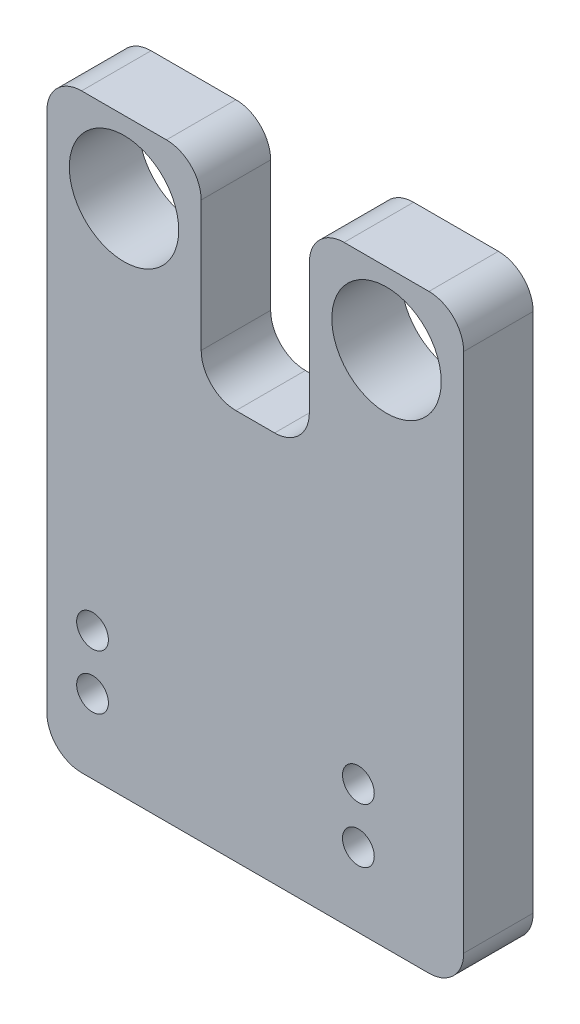
ISO-10303-21;
HEADER;
FILE_DESCRIPTION(('STEP AP214'),'2;1');
FILE_NAME('part.step','',(''),(''),'','','');
FILE_SCHEMA(('AUTOMOTIVE_DESIGN { 1 0 10303 214 1 1 1 1 }'));
ENDSEC;
DATA;
#1=APPLICATION_CONTEXT('core data for automotive mechanical design processes');
#2=APPLICATION_PROTOCOL_DEFINITION('international standard','automotive_design',2000,#1);
#3=PRODUCT_CONTEXT('',#1,'mechanical');
#4=PRODUCT('Part','Part','',(#3));
#5=PRODUCT_RELATED_PRODUCT_CATEGORY('part','',(#4));
#6=PRODUCT_DEFINITION_FORMATION('','',#4);
#7=PRODUCT_DEFINITION_CONTEXT('part definition',#1,'design');
#8=PRODUCT_DEFINITION('design','',#6,#7);
#9=PRODUCT_DEFINITION_SHAPE('','',#8);
#10=(LENGTH_UNIT() NAMED_UNIT(*) SI_UNIT(.MILLI.,.METRE.));
#11=(NAMED_UNIT(*) PLANE_ANGLE_UNIT() SI_UNIT($,.RADIAN.));
#12=(NAMED_UNIT(*) SI_UNIT($,.STERADIAN.) SOLID_ANGLE_UNIT());
#13=UNCERTAINTY_MEASURE_WITH_UNIT(LENGTH_MEASURE(1.E-05),#10,'distance_accuracy_value','');
#14=(GEOMETRIC_REPRESENTATION_CONTEXT(3) GLOBAL_UNCERTAINTY_ASSIGNED_CONTEXT((#13)) GLOBAL_UNIT_ASSIGNED_CONTEXT((#10,
#11,#12)) REPRESENTATION_CONTEXT('',''));
#15=CARTESIAN_POINT('',(0.,0.,0.));
#16=DIRECTION('',(0.,0.,1.));
#17=DIRECTION('',(1.,0.,0.));
#18=AXIS2_PLACEMENT_3D('',#15,#16,#17);
#19=CARTESIAN_POINT('',(-38.1,0.,6.35));
#20=DIRECTION('',(1.,0.,0.));
#21=DIRECTION('',(0.,0.,-1.));
#22=AXIS2_PLACEMENT_3D('',#19,#20,#21);
#23=PLANE('',#22);
#24=DIRECTION('',(0.,-1.,0.));
#25=VECTOR('',#24,1.);
#26=CARTESIAN_POINT('',(-38.1,0.,-6.35));
#27=LINE('',#26,#25);
#28=CARTESIAN_POINT('',(-38.1,23.625,-6.35));
#29=VERTEX_POINT('',#28);
#30=CARTESIAN_POINT('',(-38.1,-71.625,-6.35));
#31=VERTEX_POINT('',#30);
#32=EDGE_CURVE('E295',#29,#31,#27,.T.);
#33=ORIENTED_EDGE('',*,*,#32,.T.);
#34=DIRECTION('',(0.,0.,-1.));
#35=VECTOR('',#34,1.);
#36=CARTESIAN_POINT('',(-38.1,-71.625,6.35));
#37=LINE('',#36,#35);
#38=CARTESIAN_POINT('',(-38.1,-71.625,6.35));
#39=VERTEX_POINT('',#38);
#40=EDGE_CURVE('E224',#31,#39,#37,.F.);
#41=ORIENTED_EDGE('',*,*,#40,.T.);
#42=DIRECTION('',(0.,-1.,0.));
#43=VECTOR('',#42,1.);
#44=CARTESIAN_POINT('',(-38.1,0.,6.35));
#45=LINE('',#44,#43);
#46=CARTESIAN_POINT('',(-38.1,23.625,6.35));
#47=VERTEX_POINT('',#46);
#48=EDGE_CURVE('E330',#47,#39,#45,.T.);
#49=ORIENTED_EDGE('',*,*,#48,.F.);
#50=DIRECTION('',(0.,0.,-1.));
#51=VECTOR('',#50,1.);
#52=CARTESIAN_POINT('',(-38.1,23.625,-6.35));
#53=LINE('',#52,#51);
#54=EDGE_CURVE('E221',#47,#29,#53,.T.);
#55=ORIENTED_EDGE('',*,*,#54,.T.);
#56=EDGE_LOOP('',(#33,#41,#49,#55));
#57=FACE_BOUND('',#56,.T.);
#58=ADVANCED_FACE('F43',(#57),#23,.F.);
#59=CARTESIAN_POINT('',(0.,-77.975,6.35));
#60=DIRECTION('',(0.,1.,0.));
#61=DIRECTION('',(0.,0.,1.));
#62=AXIS2_PLACEMENT_3D('',#59,#60,#61);
#63=PLANE('',#62);
#64=DIRECTION('',(1.,0.,0.));
#65=VECTOR('',#64,1.);
#66=CARTESIAN_POINT('',(0.,-77.975,-6.35));
#67=LINE('',#66,#65);
#68=CARTESIAN_POINT('',(-31.75,-77.975,-6.35));
#69=VERTEX_POINT('',#68);
#70=CARTESIAN_POINT('',(31.75,-77.975,-6.35));
#71=VERTEX_POINT('',#70);
#72=EDGE_CURVE('E298',#69,#71,#67,.T.);
#73=ORIENTED_EDGE('',*,*,#72,.T.);
#74=DIRECTION('',(0.,0.,-1.));
#75=VECTOR('',#74,1.);
#76=CARTESIAN_POINT('',(31.75,-77.975,6.35));
#77=LINE('',#76,#75);
#78=CARTESIAN_POINT('',(31.75,-77.975,6.35));
#79=VERTEX_POINT('',#78);
#80=EDGE_CURVE('E219',#71,#79,#77,.F.);
#81=ORIENTED_EDGE('',*,*,#80,.T.);
#82=DIRECTION('',(1.,0.,0.));
#83=VECTOR('',#82,1.);
#84=CARTESIAN_POINT('',(0.,-77.975,6.35));
#85=LINE('',#84,#83);
#86=CARTESIAN_POINT('',(-31.75,-77.975,6.35));
#87=VERTEX_POINT('',#86);
#88=EDGE_CURVE('E333',#87,#79,#85,.T.);
#89=ORIENTED_EDGE('',*,*,#88,.F.);
#90=DIRECTION('',(0.,0.,-1.));
#91=VECTOR('',#90,1.);
#92=CARTESIAN_POINT('',(-31.75,-77.975,6.35));
#93=LINE('',#92,#91);
#94=EDGE_CURVE('E216',#87,#69,#93,.T.);
#95=ORIENTED_EDGE('',*,*,#94,.T.);
#96=EDGE_LOOP('',(#73,#81,#89,#95));
#97=FACE_BOUND('',#96,.T.);
#98=ADVANCED_FACE('F352',(#97),#63,.F.);
#99=CARTESIAN_POINT('',(38.1,0.,6.35));
#100=DIRECTION('',(1.,0.,0.));
#101=DIRECTION('',(0.,0.,-1.));
#102=AXIS2_PLACEMENT_3D('',#99,#100,#101);
#103=PLANE('',#102);
#104=DIRECTION('',(0.,-1.,0.));
#105=VECTOR('',#104,1.);
#106=CARTESIAN_POINT('',(38.1,0.,-6.35));
#107=LINE('',#106,#105);
#108=CARTESIAN_POINT('',(38.1,23.625,-6.35));
#109=VERTEX_POINT('',#108);
#110=CARTESIAN_POINT('',(38.1,-71.625,-6.35));
#111=VERTEX_POINT('',#110);
#112=EDGE_CURVE('E178',#109,#111,#107,.T.);
#113=ORIENTED_EDGE('',*,*,#112,.F.);
#114=DIRECTION('',(0.,0.,-1.));
#115=VECTOR('',#114,1.);
#116=CARTESIAN_POINT('',(38.1,23.625,6.35));
#117=LINE('',#116,#115);
#118=CARTESIAN_POINT('',(38.1,23.625,6.35));
#119=VERTEX_POINT('',#118);
#120=EDGE_CURVE('E204',#109,#119,#117,.F.);
#121=ORIENTED_EDGE('',*,*,#120,.T.);
#122=DIRECTION('',(0.,-1.,0.));
#123=VECTOR('',#122,1.);
#124=CARTESIAN_POINT('',(38.1,0.,6.35));
#125=LINE('',#124,#123);
#126=CARTESIAN_POINT('',(38.1,-71.625,6.35));
#127=VERTEX_POINT('',#126);
#128=EDGE_CURVE('E336',#119,#127,#125,.T.);
#129=ORIENTED_EDGE('',*,*,#128,.T.);
#130=DIRECTION('',(0.,0.,-1.));
#131=VECTOR('',#130,1.);
#132=CARTESIAN_POINT('',(38.1,-71.625,-6.35));
#133=LINE('',#132,#131);
#134=EDGE_CURVE('E201',#127,#111,#133,.T.);
#135=ORIENTED_EDGE('',*,*,#134,.T.);
#136=EDGE_LOOP('',(#113,#121,#129,#135));
#137=FACE_BOUND('',#136,.T.);
#138=ADVANCED_FACE('F344',(#137),#103,.T.);
#139=CARTESIAN_POINT('',(0.,29.975,6.35));
#140=DIRECTION('',(0.,1.,0.));
#141=DIRECTION('',(0.,0.,1.));
#142=AXIS2_PLACEMENT_3D('',#139,#140,#141);
#143=PLANE('',#142);
#144=DIRECTION('',(1.,0.,0.));
#145=VECTOR('',#144,1.);
#146=CARTESIAN_POINT('',(0.,29.975,6.35));
#147=LINE('',#146,#145);
#148=CARTESIAN_POINT('',(16.236,29.975,6.35));
#149=VERTEX_POINT('',#148);
#150=CARTESIAN_POINT('',(31.75,29.975,6.35));
#151=VERTEX_POINT('',#150);
#152=EDGE_CURVE('E276',#149,#151,#147,.T.);
#153=ORIENTED_EDGE('',*,*,#152,.T.);
#154=DIRECTION('',(0.,0.,-1.));
#155=VECTOR('',#154,1.);
#156=CARTESIAN_POINT('',(31.75,29.975,6.35));
#157=LINE('',#156,#155);
#158=CARTESIAN_POINT('',(31.75,29.975,-6.35));
#159=VERTEX_POINT('',#158);
#160=EDGE_CURVE('E169',#151,#159,#157,.T.);
#161=ORIENTED_EDGE('',*,*,#160,.T.);
#162=DIRECTION('',(1.,0.,0.));
#163=VECTOR('',#162,1.);
#164=CARTESIAN_POINT('',(0.,29.975,-6.35));
#165=LINE('',#164,#163);
#166=CARTESIAN_POINT('',(16.236,29.975,-6.35));
#167=VERTEX_POINT('',#166);
#168=EDGE_CURVE('E161',#167,#159,#165,.T.);
#169=ORIENTED_EDGE('',*,*,#168,.F.);
#170=DIRECTION('',(0.,0.,-1.));
#171=VECTOR('',#170,1.);
#172=CARTESIAN_POINT('',(16.236,29.975,6.35));
#173=LINE('',#172,#171);
#174=EDGE_CURVE('E175',#167,#149,#173,.F.);
#175=ORIENTED_EDGE('',*,*,#174,.T.);
#176=EDGE_LOOP('',(#153,#161,#169,#175));
#177=FACE_BOUND('',#176,.T.);
#178=ADVANCED_FACE('F174',(#177),#143,.T.);
#179=CARTESIAN_POINT('',(9.886,0.,6.35));
#180=DIRECTION('',(1.,0.,0.));
#181=DIRECTION('',(0.,0.,-1.));
#182=AXIS2_PLACEMENT_3D('',#179,#180,#181);
#183=PLANE('',#182);
#184=DIRECTION('',(0.,-1.,0.));
#185=VECTOR('',#184,1.);
#186=CARTESIAN_POINT('',(9.886,0.,-6.35));
#187=LINE('',#186,#185);
#188=CARTESIAN_POINT('',(9.886,23.625,-6.35));
#189=VERTEX_POINT('',#188);
#190=CARTESIAN_POINT('',(9.886,-0.187499999999988,-6.35));
#191=VERTEX_POINT('',#190);
#192=EDGE_CURVE('E163',#189,#191,#187,.T.);
#193=ORIENTED_EDGE('',*,*,#192,.T.);
#194=DIRECTION('',(0.,0.,-1.));
#195=VECTOR('',#194,1.);
#196=CARTESIAN_POINT('',(9.886,-0.187499999999988,6.35));
#197=LINE('',#196,#195);
#198=CARTESIAN_POINT('',(9.886,-0.187499999999988,6.35));
#199=VERTEX_POINT('',#198);
#200=EDGE_CURVE('E242',#191,#199,#197,.F.);
#201=ORIENTED_EDGE('',*,*,#200,.T.);
#202=DIRECTION('',(0.,-1.,0.));
#203=VECTOR('',#202,1.);
#204=CARTESIAN_POINT('',(9.886,0.,6.35));
#205=LINE('',#204,#203);
#206=CARTESIAN_POINT('',(9.886,23.625,6.35));
#207=VERTEX_POINT('',#206);
#208=EDGE_CURVE('E267',#207,#199,#205,.T.);
#209=ORIENTED_EDGE('',*,*,#208,.F.);
#210=DIRECTION('',(0.,0.,-1.));
#211=VECTOR('',#210,1.);
#212=CARTESIAN_POINT('',(9.886,23.625,-6.35));
#213=LINE('',#212,#211);
#214=EDGE_CURVE('E240',#207,#189,#213,.T.);
#215=ORIENTED_EDGE('',*,*,#214,.T.);
#216=EDGE_LOOP('',(#193,#201,#209,#215));
#217=FACE_BOUND('',#216,.T.);
#218=ADVANCED_FACE('F254',(#217),#183,.F.);
#219=CARTESIAN_POINT('',(0.,-6.53749999999999,6.35));
#220=DIRECTION('',(0.,-1.,0.));
#221=DIRECTION('',(0.,0.,-1.));
#222=AXIS2_PLACEMENT_3D('',#219,#220,#221);
#223=PLANE('',#222);
#224=DIRECTION('',(-1.,0.,0.));
#225=VECTOR('',#224,1.);
#226=CARTESIAN_POINT('',(0.,-6.53749999999999,-6.35));
#227=LINE('',#226,#225);
#228=CARTESIAN_POINT('',(3.536,-6.53749999999999,-6.35));
#229=VERTEX_POINT('',#228);
#230=CARTESIAN_POINT('',(-3.53599999999999,-6.53749999999999,-6.35));
#231=VERTEX_POINT('',#230);
#232=EDGE_CURVE('E249',#229,#231,#227,.T.);
#233=ORIENTED_EDGE('',*,*,#232,.T.);
#234=DIRECTION('',(0.,0.,-1.));
#235=VECTOR('',#234,1.);
#236=CARTESIAN_POINT('',(-3.53599999999999,-6.53749999999999,6.35));
#237=LINE('',#236,#235);
#238=CARTESIAN_POINT('',(-3.53599999999999,-6.53749999999999,6.35));
#239=VERTEX_POINT('',#238);
#240=EDGE_CURVE('E238',#231,#239,#237,.F.);
#241=ORIENTED_EDGE('',*,*,#240,.T.);
#242=DIRECTION('',(-1.,0.,0.));
#243=VECTOR('',#242,1.);
#244=CARTESIAN_POINT('',(0.,-6.53749999999999,6.35));
#245=LINE('',#244,#243);
#246=CARTESIAN_POINT('',(3.536,-6.53749999999999,6.35));
#247=VERTEX_POINT('',#246);
#248=EDGE_CURVE('E265',#247,#239,#245,.T.);
#249=ORIENTED_EDGE('',*,*,#248,.F.);
#250=DIRECTION('',(0.,0.,-1.));
#251=VECTOR('',#250,1.);
#252=CARTESIAN_POINT('',(3.536,-6.53749999999999,-6.35));
#253=LINE('',#252,#251);
#254=EDGE_CURVE('E235',#247,#229,#253,.T.);
#255=ORIENTED_EDGE('',*,*,#254,.T.);
#256=EDGE_LOOP('',(#233,#241,#249,#255));
#257=FACE_BOUND('',#256,.T.);
#258=ADVANCED_FACE('F269',(#257),#223,.F.);
#259=CARTESIAN_POINT('',(-9.88599999999999,0.,6.35));
#260=DIRECTION('',(1.,0.,0.));
#261=DIRECTION('',(0.,1.,0.));
#262=AXIS2_PLACEMENT_3D('',#259,#260,#261);
#263=PLANE('',#262);
#264=DIRECTION('',(0.,-1.,0.));
#265=VECTOR('',#264,1.);
#266=CARTESIAN_POINT('',(-9.88599999999999,0.,-6.35));
#267=LINE('',#266,#265);
#268=CARTESIAN_POINT('',(-9.88599999999999,23.625,-6.35));
#269=VERTEX_POINT('',#268);
#270=CARTESIAN_POINT('',(-9.88599999999999,-0.187499999999989,-6.35));
#271=VERTEX_POINT('',#270);
#272=EDGE_CURVE('E304',#269,#271,#267,.T.);
#273=ORIENTED_EDGE('',*,*,#272,.F.);
#274=DIRECTION('',(0.,0.,-1.));
#275=VECTOR('',#274,1.);
#276=CARTESIAN_POINT('',(-9.88599999999999,23.625,6.35));
#277=LINE('',#276,#275);
#278=CARTESIAN_POINT('',(-9.88599999999999,23.625,6.35));
#279=VERTEX_POINT('',#278);
#280=EDGE_CURVE('E233',#269,#279,#277,.F.);
#281=ORIENTED_EDGE('',*,*,#280,.T.);
#282=DIRECTION('',(0.,-1.,0.));
#283=VECTOR('',#282,1.);
#284=CARTESIAN_POINT('',(-9.88599999999999,0.,6.35));
#285=LINE('',#284,#283);
#286=CARTESIAN_POINT('',(-9.88599999999999,-0.187499999999989,6.35));
#287=VERTEX_POINT('',#286);
#288=EDGE_CURVE('E271',#279,#287,#285,.T.);
#289=ORIENTED_EDGE('',*,*,#288,.T.);
#290=DIRECTION('',(0.,0.,-1.));
#291=VECTOR('',#290,1.);
#292=CARTESIAN_POINT('',(-9.88599999999999,-0.187499999999989,6.35));
#293=LINE('',#292,#291);
#294=EDGE_CURVE('E230',#287,#271,#293,.T.);
#295=ORIENTED_EDGE('',*,*,#294,.T.);
#296=EDGE_LOOP('',(#273,#281,#289,#295));
#297=FACE_BOUND('',#296,.T.);
#298=ADVANCED_FACE('F373',(#297),#263,.T.);
#299=CARTESIAN_POINT('',(23.993,16.8,6.35));
#300=DIRECTION('',(0.,0.,-1.));
#301=DIRECTION('',(-1.,0.,0.));
#302=AXIS2_PLACEMENT_3D('',#299,#300,#301);
#303=CYLINDRICAL_SURFACE('',#302,10.);
#304=CARTESIAN_POINT('',(23.993,16.8,6.35));
#305=DIRECTION('',(0.,0.,1.));
#306=DIRECTION('',(1.,0.,0.));
#307=AXIS2_PLACEMENT_3D('',#304,#305,#306);
#308=CIRCLE('',#307,10.);
#309=CARTESIAN_POINT('',(33.993,16.8,6.35));
#310=VERTEX_POINT('',#309);
#311=EDGE_CURVE('E186',#310,#310,#308,.T.);
#312=ORIENTED_EDGE('',*,*,#311,.T.);
#313=EDGE_LOOP('',(#312));
#314=FACE_BOUND('',#313,.T.);
#315=CARTESIAN_POINT('',(23.993,16.8,-6.35));
#316=DIRECTION('',(0.,0.,1.));
#317=DIRECTION('',(1.,0.,0.));
#318=AXIS2_PLACEMENT_3D('',#315,#316,#317);
#319=CIRCLE('',#318,10.);
#320=CARTESIAN_POINT('',(33.993,16.8,-6.35));
#321=VERTEX_POINT('',#320);
#322=EDGE_CURVE('E309',#321,#321,#319,.T.);
#323=ORIENTED_EDGE('',*,*,#322,.F.);
#324=EDGE_LOOP('',(#323));
#325=FACE_BOUND('',#324,.T.);
#326=ADVANCED_FACE('F509',(#314,#325),#303,.F.);
#327=CARTESIAN_POINT('',(0.,29.975,6.35));
#328=DIRECTION('',(0.,1.,0.));
#329=DIRECTION('',(0.,0.,1.));
#330=AXIS2_PLACEMENT_3D('',#327,#328,#329);
#331=PLANE('',#330);
#332=DIRECTION('',(1.,0.,0.));
#333=VECTOR('',#332,1.);
#334=CARTESIAN_POINT('',(0.,29.975,-6.35));
#335=LINE('',#334,#333);
#336=CARTESIAN_POINT('',(-31.75,29.975,-6.35));
#337=VERTEX_POINT('',#336);
#338=CARTESIAN_POINT('',(-16.236,29.975,-6.35));
#339=VERTEX_POINT('',#338);
#340=EDGE_CURVE('E307',#337,#339,#335,.T.);
#341=ORIENTED_EDGE('',*,*,#340,.F.);
#342=DIRECTION('',(0.,0.,-1.));
#343=VECTOR('',#342,1.);
#344=CARTESIAN_POINT('',(-31.75,29.975,6.35));
#345=LINE('',#344,#343);
#346=CARTESIAN_POINT('',(-31.75,29.975,6.35));
#347=VERTEX_POINT('',#346);
#348=EDGE_CURVE('E65',#337,#347,#345,.F.);
#349=ORIENTED_EDGE('',*,*,#348,.T.);
#350=DIRECTION('',(1.,0.,0.));
#351=VECTOR('',#350,1.);
#352=CARTESIAN_POINT('',(0.,29.975,6.35));
#353=LINE('',#352,#351);
#354=CARTESIAN_POINT('',(-16.236,29.975,6.35));
#355=VERTEX_POINT('',#354);
#356=EDGE_CURVE('E274',#347,#355,#353,.T.);
#357=ORIENTED_EDGE('',*,*,#356,.T.);
#358=DIRECTION('',(0.,0.,-1.));
#359=VECTOR('',#358,1.);
#360=CARTESIAN_POINT('',(-16.236,29.975,6.35));
#361=LINE('',#360,#359);
#362=EDGE_CURVE('E226',#355,#339,#361,.T.);
#363=ORIENTED_EDGE('',*,*,#362,.T.);
#364=EDGE_LOOP('',(#341,#349,#357,#363));
#365=FACE_BOUND('',#364,.T.);
#366=ADVANCED_FACE('F366',(#365),#331,.T.);
#367=CARTESIAN_POINT('',(-29.75,-54.475,6.35));
#368=DIRECTION('',(0.,0.,-1.));
#369=DIRECTION('',(-1.,0.,0.));
#370=AXIS2_PLACEMENT_3D('',#367,#368,#369);
#371=CYLINDRICAL_SURFACE('',#370,2.90276928589563);
#372=CARTESIAN_POINT('',(-29.75,-54.475,6.35));
#373=DIRECTION('',(0.,0.,1.));
#374=DIRECTION('',(1.,0.,0.));
#375=AXIS2_PLACEMENT_3D('',#372,#373,#374);
#376=CIRCLE('',#375,2.90276928589563);
#377=CARTESIAN_POINT('',(-26.8472307141044,-54.475,6.35));
#378=VERTEX_POINT('',#377);
#379=EDGE_CURVE('E327',#378,#378,#376,.T.);
#380=ORIENTED_EDGE('',*,*,#379,.T.);
#381=EDGE_LOOP('',(#380));
#382=FACE_BOUND('',#381,.T.);
#383=CARTESIAN_POINT('',(-29.75,-54.475,-6.35));
#384=DIRECTION('',(0.,0.,1.));
#385=DIRECTION('',(1.,0.,0.));
#386=AXIS2_PLACEMENT_3D('',#383,#384,#385);
#387=CIRCLE('',#386,2.90276928589563);
#388=CARTESIAN_POINT('',(-26.8472307141044,-54.475,-6.35));
#389=VERTEX_POINT('',#388);
#390=EDGE_CURVE('E292',#389,#389,#387,.T.);
#391=ORIENTED_EDGE('',*,*,#390,.F.);
#392=EDGE_LOOP('',(#391));
#393=FACE_BOUND('',#392,.T.);
#394=ADVANCED_FACE('F393',(#382,#393),#371,.F.);
#395=CARTESIAN_POINT('',(-29.75,-64.475,6.35));
#396=DIRECTION('',(0.,0.,-1.));
#397=DIRECTION('',(-1.,0.,0.));
#398=AXIS2_PLACEMENT_3D('',#395,#396,#397);
#399=CYLINDRICAL_SURFACE('',#398,2.90276928589564);
#400=CARTESIAN_POINT('',(-29.75,-64.475,6.35));
#401=DIRECTION('',(0.,0.,1.));
#402=DIRECTION('',(1.,0.,0.));
#403=AXIS2_PLACEMENT_3D('',#400,#401,#402);
#404=CIRCLE('',#403,2.90276928589564);
#405=CARTESIAN_POINT('',(-26.8472307141044,-64.475,6.35));
#406=VERTEX_POINT('',#405);
#407=EDGE_CURVE('E322',#406,#406,#404,.T.);
#408=ORIENTED_EDGE('',*,*,#407,.T.);
#409=EDGE_LOOP('',(#408));
#410=FACE_BOUND('',#409,.T.);
#411=CARTESIAN_POINT('',(-29.75,-64.475,-6.35));
#412=DIRECTION('',(0.,0.,1.));
#413=DIRECTION('',(1.,0.,0.));
#414=AXIS2_PLACEMENT_3D('',#411,#412,#413);
#415=CIRCLE('',#414,2.90276928589564);
#416=CARTESIAN_POINT('',(-26.8472307141044,-64.475,-6.35));
#417=VERTEX_POINT('',#416);
#418=EDGE_CURVE('E289',#417,#417,#415,.T.);
#419=ORIENTED_EDGE('',*,*,#418,.F.);
#420=EDGE_LOOP('',(#419));
#421=FACE_BOUND('',#420,.T.);
#422=ADVANCED_FACE('F396',(#410,#421),#399,.F.);
#423=CARTESIAN_POINT('',(18.85,-54.475,6.35));
#424=DIRECTION('',(0.,0.,-1.));
#425=DIRECTION('',(-1.,0.,0.));
#426=AXIS2_PLACEMENT_3D('',#423,#424,#425);
#427=CYLINDRICAL_SURFACE('',#426,2.90276928589561);
#428=CARTESIAN_POINT('',(18.85,-54.475,6.35));
#429=DIRECTION('',(0.,0.,1.));
#430=DIRECTION('',(1.,0.,0.));
#431=AXIS2_PLACEMENT_3D('',#428,#429,#430);
#432=CIRCLE('',#431,2.90276928589561);
#433=CARTESIAN_POINT('',(21.7527692858956,-54.475,6.35));
#434=VERTEX_POINT('',#433);
#435=EDGE_CURVE('E317',#434,#434,#432,.T.);
#436=ORIENTED_EDGE('',*,*,#435,.T.);
#437=EDGE_LOOP('',(#436));
#438=FACE_BOUND('',#437,.T.);
#439=CARTESIAN_POINT('',(18.85,-54.475,-6.35));
#440=DIRECTION('',(0.,0.,1.));
#441=DIRECTION('',(1.,0.,0.));
#442=AXIS2_PLACEMENT_3D('',#439,#440,#441);
#443=CIRCLE('',#442,2.90276928589561);
#444=CARTESIAN_POINT('',(21.7527692858956,-54.475,-6.35));
#445=VERTEX_POINT('',#444);
#446=EDGE_CURVE('E286',#445,#445,#443,.T.);
#447=ORIENTED_EDGE('',*,*,#446,.F.);
#448=EDGE_LOOP('',(#447));
#449=FACE_BOUND('',#448,.T.);
#450=ADVANCED_FACE('F400',(#438,#449),#427,.F.);
#451=CARTESIAN_POINT('',(18.85,-64.475,6.35));
#452=DIRECTION('',(0.,0.,-1.));
#453=DIRECTION('',(-1.,0.,0.));
#454=AXIS2_PLACEMENT_3D('',#451,#452,#453);
#455=CYLINDRICAL_SURFACE('',#454,2.9027692858956);
#456=CARTESIAN_POINT('',(18.85,-64.475,6.35));
#457=DIRECTION('',(0.,0.,1.));
#458=DIRECTION('',(1.,0.,0.));
#459=AXIS2_PLACEMENT_3D('',#456,#457,#458);
#460=CIRCLE('',#459,2.9027692858956);
#461=CARTESIAN_POINT('',(21.7527692858956,-64.475,6.35));
#462=VERTEX_POINT('',#461);
#463=EDGE_CURVE('E313',#462,#462,#460,.T.);
#464=ORIENTED_EDGE('',*,*,#463,.T.);
#465=EDGE_LOOP('',(#464));
#466=FACE_BOUND('',#465,.T.);
#467=CARTESIAN_POINT('',(18.85,-64.475,-6.35));
#468=DIRECTION('',(0.,0.,1.));
#469=DIRECTION('',(1.,0.,0.));
#470=AXIS2_PLACEMENT_3D('',#467,#468,#469);
#471=CIRCLE('',#470,2.9027692858956);
#472=CARTESIAN_POINT('',(21.7527692858956,-64.475,-6.35));
#473=VERTEX_POINT('',#472);
#474=EDGE_CURVE('E283',#473,#473,#471,.T.);
#475=ORIENTED_EDGE('',*,*,#474,.F.);
#476=EDGE_LOOP('',(#475));
#477=FACE_BOUND('',#476,.T.);
#478=ADVANCED_FACE('F404',(#466,#477),#455,.F.);
#479=CARTESIAN_POINT('',(-23.993,16.8,6.35));
#480=DIRECTION('',(0.,0.,-1.));
#481=DIRECTION('',(-1.,0.,0.));
#482=AXIS2_PLACEMENT_3D('',#479,#480,#481);
#483=CYLINDRICAL_SURFACE('',#482,10.);
#484=CARTESIAN_POINT('',(-23.993,16.8,6.35));
#485=DIRECTION('',(0.,0.,1.));
#486=DIRECTION('',(1.,0.,0.));
#487=AXIS2_PLACEMENT_3D('',#484,#485,#486);
#488=CIRCLE('',#487,10.);
#489=CARTESIAN_POINT('',(-13.993,16.8,6.35));
#490=VERTEX_POINT('',#489);
#491=EDGE_CURVE('E182',#490,#490,#488,.F.);
#492=ORIENTED_EDGE('',*,*,#491,.F.);
#493=EDGE_LOOP('',(#492));
#494=FACE_BOUND('',#493,.T.);
#495=CARTESIAN_POINT('',(-23.993,16.8,-6.35));
#496=DIRECTION('',(0.,0.,1.));
#497=DIRECTION('',(1.,0.,0.));
#498=AXIS2_PLACEMENT_3D('',#495,#496,#497);
#499=CIRCLE('',#498,10.);
#500=CARTESIAN_POINT('',(-13.993,16.8,-6.35));
#501=VERTEX_POINT('',#500);
#502=EDGE_CURVE('E189',#501,#501,#499,.F.);
#503=ORIENTED_EDGE('',*,*,#502,.T.);
#504=EDGE_LOOP('',(#503));
#505=FACE_BOUND('',#504,.T.);
#506=ADVANCED_FACE('F408',(#494,#505),#483,.F.);
#507=CARTESIAN_POINT('',(0.,0.,6.35));
#508=DIRECTION('',(0.,0.,1.));
#509=DIRECTION('',(1.,0.,0.));
#510=AXIS2_PLACEMENT_3D('',#507,#508,#509);
#511=PLANE('',#510);
#512=ORIENTED_EDGE('',*,*,#463,.F.);
#513=EDGE_LOOP('',(#512));
#514=FACE_BOUND('',#513,.T.);
#515=ORIENTED_EDGE('',*,*,#435,.F.);
#516=EDGE_LOOP('',(#515));
#517=FACE_BOUND('',#516,.T.);
#518=ORIENTED_EDGE('',*,*,#407,.F.);
#519=EDGE_LOOP('',(#518));
#520=FACE_BOUND('',#519,.T.);
#521=ORIENTED_EDGE('',*,*,#379,.F.);
#522=EDGE_LOOP('',(#521));
#523=FACE_BOUND('',#522,.T.);
#524=ORIENTED_EDGE('',*,*,#128,.F.);
#525=CARTESIAN_POINT('',(31.75,23.625,6.35));
#526=DIRECTION('',(0.,0.,1.));
#527=DIRECTION('',(1.,0.,0.));
#528=AXIS2_PLACEMENT_3D('',#525,#526,#527);
#529=CIRCLE('',#528,6.35);
#530=EDGE_CURVE('E214',#119,#151,#529,.T.);
#531=ORIENTED_EDGE('',*,*,#530,.T.);
#532=ORIENTED_EDGE('',*,*,#152,.F.);
#533=CARTESIAN_POINT('',(16.236,23.625,6.35));
#534=DIRECTION('',(0.,0.,1.));
#535=DIRECTION('',(1.,0.,0.));
#536=AXIS2_PLACEMENT_3D('',#533,#534,#535);
#537=CIRCLE('',#536,6.35);
#538=EDGE_CURVE('E181',#149,#207,#537,.T.);
#539=ORIENTED_EDGE('',*,*,#538,.T.);
#540=ORIENTED_EDGE('',*,*,#208,.T.);
#541=CARTESIAN_POINT('',(3.536,-0.187499999999988,6.35));
#542=DIRECTION('',(0.,0.,1.));
#543=DIRECTION('',(1.,0.,0.));
#544=AXIS2_PLACEMENT_3D('',#541,#542,#543);
#545=CIRCLE('',#544,6.35);
#546=EDGE_CURVE('E11',#199,#247,#545,.F.);
#547=ORIENTED_EDGE('',*,*,#546,.T.);
#548=ORIENTED_EDGE('',*,*,#248,.T.);
#549=CARTESIAN_POINT('',(-3.53599999999999,-0.187499999999988,6.35));
#550=DIRECTION('',(0.,0.,1.));
#551=DIRECTION('',(1.,0.,0.));
#552=AXIS2_PLACEMENT_3D('',#549,#550,#551);
#553=CIRCLE('',#552,6.35);
#554=EDGE_CURVE('E246',#239,#287,#553,.F.);
#555=ORIENTED_EDGE('',*,*,#554,.T.);
#556=ORIENTED_EDGE('',*,*,#288,.F.);
#557=CARTESIAN_POINT('',(-16.236,23.625,6.35));
#558=DIRECTION('',(0.,0.,1.));
#559=DIRECTION('',(1.,0.,0.));
#560=AXIS2_PLACEMENT_3D('',#557,#558,#559);
#561=CIRCLE('',#560,6.35);
#562=EDGE_CURVE('E58',#279,#355,#561,.T.);
#563=ORIENTED_EDGE('',*,*,#562,.T.);
#564=ORIENTED_EDGE('',*,*,#356,.F.);
#565=CARTESIAN_POINT('',(-31.75,23.625,6.35));
#566=DIRECTION('',(0.,0.,1.));
#567=DIRECTION('',(1.,0.,0.));
#568=AXIS2_PLACEMENT_3D('',#565,#566,#567);
#569=CIRCLE('',#568,6.35);
#570=EDGE_CURVE('E208',#347,#47,#569,.T.);
#571=ORIENTED_EDGE('',*,*,#570,.T.);
#572=ORIENTED_EDGE('',*,*,#48,.T.);
#573=CARTESIAN_POINT('',(-31.75,-71.625,6.35));
#574=DIRECTION('',(0.,0.,1.));
#575=DIRECTION('',(1.,0.,0.));
#576=AXIS2_PLACEMENT_3D('',#573,#574,#575);
#577=CIRCLE('',#576,6.35);
#578=EDGE_CURVE('E210',#39,#87,#577,.T.);
#579=ORIENTED_EDGE('',*,*,#578,.T.);
#580=ORIENTED_EDGE('',*,*,#88,.T.);
#581=CARTESIAN_POINT('',(31.75,-71.625,6.35));
#582=DIRECTION('',(0.,0.,1.));
#583=DIRECTION('',(1.,0.,0.));
#584=AXIS2_PLACEMENT_3D('',#581,#582,#583);
#585=CIRCLE('',#584,6.35);
#586=EDGE_CURVE('E212',#79,#127,#585,.T.);
#587=ORIENTED_EDGE('',*,*,#586,.T.);
#588=EDGE_LOOP('',(#524,#531,#532,#539,#540,#547,#548,#555,#556,#563,#564,#571,#572,#579,#580,#587));
#589=FACE_BOUND('',#588,.T.);
#590=ORIENTED_EDGE('',*,*,#311,.F.);
#591=EDGE_LOOP('',(#590));
#592=FACE_BOUND('',#591,.T.);
#593=ORIENTED_EDGE('',*,*,#491,.T.);
#594=EDGE_LOOP('',(#593));
#595=FACE_BOUND('',#594,.T.);
#596=ADVANCED_FACE('F263',(#514,#517,#520,#523,#589,#592,#595),#511,.T.);
#597=CARTESIAN_POINT('',(0.,0.,-6.35));
#598=DIRECTION('',(0.,0.,1.));
#599=DIRECTION('',(1.,0.,0.));
#600=AXIS2_PLACEMENT_3D('',#597,#598,#599);
#601=PLANE('',#600);
#602=ORIENTED_EDGE('',*,*,#474,.T.);
#603=EDGE_LOOP('',(#602));
#604=FACE_BOUND('',#603,.T.);
#605=ORIENTED_EDGE('',*,*,#446,.T.);
#606=EDGE_LOOP('',(#605));
#607=FACE_BOUND('',#606,.T.);
#608=ORIENTED_EDGE('',*,*,#418,.T.);
#609=EDGE_LOOP('',(#608));
#610=FACE_BOUND('',#609,.T.);
#611=ORIENTED_EDGE('',*,*,#390,.T.);
#612=EDGE_LOOP('',(#611));
#613=FACE_BOUND('',#612,.T.);
#614=ORIENTED_EDGE('',*,*,#168,.T.);
#615=CARTESIAN_POINT('',(31.75,23.625,-6.35));
#616=DIRECTION('',(0.,0.,1.));
#617=DIRECTION('',(1.,0.,0.));
#618=AXIS2_PLACEMENT_3D('',#615,#616,#617);
#619=CIRCLE('',#618,6.35);
#620=EDGE_CURVE('E199',#159,#109,#619,.F.);
#621=ORIENTED_EDGE('',*,*,#620,.T.);
#622=ORIENTED_EDGE('',*,*,#112,.T.);
#623=CARTESIAN_POINT('',(31.75,-71.625,-6.35));
#624=DIRECTION('',(0.,0.,1.));
#625=DIRECTION('',(1.,0.,0.));
#626=AXIS2_PLACEMENT_3D('',#623,#624,#625);
#627=CIRCLE('',#626,6.35);
#628=EDGE_CURVE('E197',#111,#71,#627,.F.);
#629=ORIENTED_EDGE('',*,*,#628,.T.);
#630=ORIENTED_EDGE('',*,*,#72,.F.);
#631=CARTESIAN_POINT('',(-31.75,-71.625,-6.35));
#632=DIRECTION('',(0.,0.,1.));
#633=DIRECTION('',(1.,0.,0.));
#634=AXIS2_PLACEMENT_3D('',#631,#632,#633);
#635=CIRCLE('',#634,6.35);
#636=EDGE_CURVE('E195',#69,#31,#635,.F.);
#637=ORIENTED_EDGE('',*,*,#636,.T.);
#638=ORIENTED_EDGE('',*,*,#32,.F.);
#639=CARTESIAN_POINT('',(-31.75,23.625,-6.35));
#640=DIRECTION('',(0.,0.,1.));
#641=DIRECTION('',(1.,0.,0.));
#642=AXIS2_PLACEMENT_3D('',#639,#640,#641);
#643=CIRCLE('',#642,6.35);
#644=EDGE_CURVE('E193',#29,#337,#643,.F.);
#645=ORIENTED_EDGE('',*,*,#644,.T.);
#646=ORIENTED_EDGE('',*,*,#340,.T.);
#647=CARTESIAN_POINT('',(-16.236,23.625,-6.35));
#648=DIRECTION('',(0.,0.,1.));
#649=DIRECTION('',(1.,0.,0.));
#650=AXIS2_PLACEMENT_3D('',#647,#648,#649);
#651=CIRCLE('',#650,6.35);
#652=EDGE_CURVE('E168',#339,#269,#651,.F.);
#653=ORIENTED_EDGE('',*,*,#652,.T.);
#654=ORIENTED_EDGE('',*,*,#272,.T.);
#655=CARTESIAN_POINT('',(-3.53599999999999,-0.187499999999988,-6.35));
#656=DIRECTION('',(0.,0.,1.));
#657=DIRECTION('',(1.,0.,0.));
#658=AXIS2_PLACEMENT_3D('',#655,#656,#657);
#659=CIRCLE('',#658,6.35);
#660=EDGE_CURVE('E244',#271,#231,#659,.T.);
#661=ORIENTED_EDGE('',*,*,#660,.T.);
#662=ORIENTED_EDGE('',*,*,#232,.F.);
#663=CARTESIAN_POINT('',(3.536,-0.187499999999988,-6.35));
#664=DIRECTION('',(0.,0.,1.));
#665=DIRECTION('',(1.,0.,0.));
#666=AXIS2_PLACEMENT_3D('',#663,#664,#665);
#667=CIRCLE('',#666,6.35);
#668=EDGE_CURVE('E51',#229,#191,#667,.T.);
#669=ORIENTED_EDGE('',*,*,#668,.T.);
#670=ORIENTED_EDGE('',*,*,#192,.F.);
#671=CARTESIAN_POINT('',(16.236,23.625,-6.35));
#672=DIRECTION('',(0.,0.,1.));
#673=DIRECTION('',(1.,0.,0.));
#674=AXIS2_PLACEMENT_3D('',#671,#672,#673);
#675=CIRCLE('',#674,6.35);
#676=EDGE_CURVE('E157',#189,#167,#675,.F.);
#677=ORIENTED_EDGE('',*,*,#676,.T.);
#678=EDGE_LOOP('',(#614,#621,#622,#629,#630,#637,#638,#645,#646,#653,#654,#661,#662,#669,#670,#677));
#679=FACE_BOUND('',#678,.T.);
#680=ORIENTED_EDGE('',*,*,#322,.T.);
#681=EDGE_LOOP('',(#680));
#682=FACE_BOUND('',#681,.T.);
#683=ORIENTED_EDGE('',*,*,#502,.F.);
#684=EDGE_LOOP('',(#683));
#685=FACE_BOUND('',#684,.T.);
#686=ADVANCED_FACE('F159',(#604,#607,#610,#613,#679,#682,#685),#601,.F.);
#687=CARTESIAN_POINT('',(31.75,23.625,6.35));
#688=DIRECTION('',(0.,0.,-1.));
#689=DIRECTION('',(-1.,0.,0.));
#690=AXIS2_PLACEMENT_3D('',#687,#688,#689);
#691=CYLINDRICAL_SURFACE('',#690,6.35);
#692=ORIENTED_EDGE('',*,*,#530,.F.);
#693=ORIENTED_EDGE('',*,*,#120,.F.);
#694=ORIENTED_EDGE('',*,*,#620,.F.);
#695=ORIENTED_EDGE('',*,*,#160,.F.);
#696=EDGE_LOOP('',(#692,#693,#694,#695));
#697=FACE_BOUND('',#696,.T.);
#698=ADVANCED_FACE('F340',(#697),#691,.T.);
#699=CARTESIAN_POINT('',(31.75,-71.625,6.35));
#700=DIRECTION('',(0.,0.,1.));
#701=DIRECTION('',(1.,0.,0.));
#702=AXIS2_PLACEMENT_3D('',#699,#700,#701);
#703=CYLINDRICAL_SURFACE('',#702,6.35);
#704=ORIENTED_EDGE('',*,*,#586,.F.);
#705=ORIENTED_EDGE('',*,*,#80,.F.);
#706=ORIENTED_EDGE('',*,*,#628,.F.);
#707=ORIENTED_EDGE('',*,*,#134,.F.);
#708=EDGE_LOOP('',(#704,#705,#706,#707));
#709=FACE_BOUND('',#708,.T.);
#710=ADVANCED_FACE('F348',(#709),#703,.T.);
#711=CARTESIAN_POINT('',(-31.75,-71.625,6.35));
#712=DIRECTION('',(0.,0.,-1.));
#713=DIRECTION('',(-1.,0.,0.));
#714=AXIS2_PLACEMENT_3D('',#711,#712,#713);
#715=CYLINDRICAL_SURFACE('',#714,6.35);
#716=ORIENTED_EDGE('',*,*,#578,.F.);
#717=ORIENTED_EDGE('',*,*,#40,.F.);
#718=ORIENTED_EDGE('',*,*,#636,.F.);
#719=ORIENTED_EDGE('',*,*,#94,.F.);
#720=EDGE_LOOP('',(#716,#717,#718,#719));
#721=FACE_BOUND('',#720,.T.);
#722=ADVANCED_FACE('F357',(#721),#715,.T.);
#723=CARTESIAN_POINT('',(-31.75,23.625,6.35));
#724=DIRECTION('',(0.,0.,1.));
#725=DIRECTION('',(1.,0.,0.));
#726=AXIS2_PLACEMENT_3D('',#723,#724,#725);
#727=CYLINDRICAL_SURFACE('',#726,6.35);
#728=ORIENTED_EDGE('',*,*,#570,.F.);
#729=ORIENTED_EDGE('',*,*,#348,.F.);
#730=ORIENTED_EDGE('',*,*,#644,.F.);
#731=ORIENTED_EDGE('',*,*,#54,.F.);
#732=EDGE_LOOP('',(#728,#729,#730,#731));
#733=FACE_BOUND('',#732,.T.);
#734=ADVANCED_FACE('F365',(#733),#727,.T.);
#735=CARTESIAN_POINT('',(-16.236,23.625,6.35));
#736=DIRECTION('',(0.,0.,-1.));
#737=DIRECTION('',(-1.,0.,0.));
#738=AXIS2_PLACEMENT_3D('',#735,#736,#737);
#739=CYLINDRICAL_SURFACE('',#738,6.35);
#740=ORIENTED_EDGE('',*,*,#562,.F.);
#741=ORIENTED_EDGE('',*,*,#280,.F.);
#742=ORIENTED_EDGE('',*,*,#652,.F.);
#743=ORIENTED_EDGE('',*,*,#362,.F.);
#744=EDGE_LOOP('',(#740,#741,#742,#743));
#745=FACE_BOUND('',#744,.T.);
#746=ADVANCED_FACE('F369',(#745),#739,.T.);
#747=CARTESIAN_POINT('',(-3.53599999999999,-0.187499999999988,6.35));
#748=DIRECTION('',(0.,0.,-1.));
#749=DIRECTION('',(-1.,0.,0.));
#750=AXIS2_PLACEMENT_3D('',#747,#748,#749);
#751=CYLINDRICAL_SURFACE('',#750,6.35);
#752=ORIENTED_EDGE('',*,*,#554,.F.);
#753=ORIENTED_EDGE('',*,*,#240,.F.);
#754=ORIENTED_EDGE('',*,*,#660,.F.);
#755=ORIENTED_EDGE('',*,*,#294,.F.);
#756=EDGE_LOOP('',(#752,#753,#754,#755));
#757=FACE_BOUND('',#756,.T.);
#758=ADVANCED_FACE('F376',(#757),#751,.F.);
#759=CARTESIAN_POINT('',(3.536,-0.187499999999988,6.35));
#760=DIRECTION('',(0.,0.,1.));
#761=DIRECTION('',(1.,0.,0.));
#762=AXIS2_PLACEMENT_3D('',#759,#760,#761);
#763=CYLINDRICAL_SURFACE('',#762,6.35);
#764=ORIENTED_EDGE('',*,*,#546,.F.);
#765=ORIENTED_EDGE('',*,*,#200,.F.);
#766=ORIENTED_EDGE('',*,*,#668,.F.);
#767=ORIENTED_EDGE('',*,*,#254,.F.);
#768=EDGE_LOOP('',(#764,#765,#766,#767));
#769=FACE_BOUND('',#768,.T.);
#770=ADVANCED_FACE('F259',(#769),#763,.F.);
#771=CARTESIAN_POINT('',(16.236,23.625,6.35));
#772=DIRECTION('',(0.,0.,1.));
#773=DIRECTION('',(1.,0.,0.));
#774=AXIS2_PLACEMENT_3D('',#771,#772,#773);
#775=CYLINDRICAL_SURFACE('',#774,6.35);
#776=ORIENTED_EDGE('',*,*,#538,.F.);
#777=ORIENTED_EDGE('',*,*,#174,.F.);
#778=ORIENTED_EDGE('',*,*,#676,.F.);
#779=ORIENTED_EDGE('',*,*,#214,.F.);
#780=EDGE_LOOP('',(#776,#777,#778,#779));
#781=FACE_BOUND('',#780,.T.);
#782=ADVANCED_FACE('F45',(#781),#775,.T.);
#783=CLOSED_SHELL('',(#58,#98,#138,#178,#218,#258,#298,#326,#366,#394,#422,#450,#478,#506,#596,
#686,#698,#710,#722,#734,#746,#758,#770,#782));
#784=MANIFOLD_SOLID_BREP('B2',#783);
#785=ADVANCED_BREP_SHAPE_REPRESENTATION('',(#18,#784),#14);
#786=SHAPE_DEFINITION_REPRESENTATION(#9,#785);
ENDSEC;
END-ISO-10303-21;
